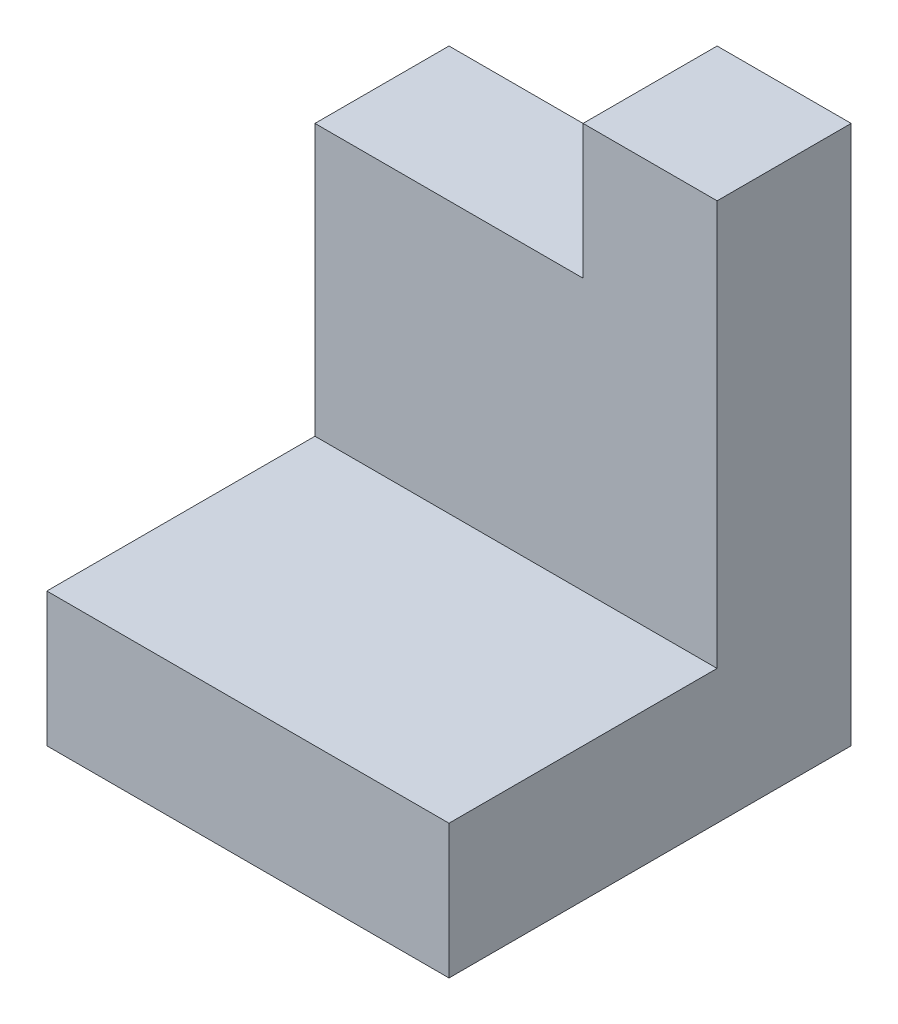
ISO-10303-21;
HEADER;
FILE_DESCRIPTION(('STEP AP214'),'2;1');
FILE_NAME('part.step','',(''),(''),'','','');
FILE_SCHEMA(('AUTOMOTIVE_DESIGN { 1 0 10303 214 1 1 1 1 }'));
ENDSEC;
DATA;
#1=APPLICATION_CONTEXT('core data for automotive mechanical design processes');
#2=APPLICATION_PROTOCOL_DEFINITION('international standard','automotive_design',2000,#1);
#3=PRODUCT_CONTEXT('',#1,'mechanical');
#4=PRODUCT('Part','Part','',(#3));
#5=PRODUCT_RELATED_PRODUCT_CATEGORY('part','',(#4));
#6=PRODUCT_DEFINITION_FORMATION('','',#4);
#7=PRODUCT_DEFINITION_CONTEXT('part definition',#1,'design');
#8=PRODUCT_DEFINITION('design','',#6,#7);
#9=PRODUCT_DEFINITION_SHAPE('','',#8);
#10=(LENGTH_UNIT() NAMED_UNIT(*) SI_UNIT(.MILLI.,.METRE.));
#11=(NAMED_UNIT(*) PLANE_ANGLE_UNIT() SI_UNIT($,.RADIAN.));
#12=(NAMED_UNIT(*) SI_UNIT($,.STERADIAN.) SOLID_ANGLE_UNIT());
#13=UNCERTAINTY_MEASURE_WITH_UNIT(LENGTH_MEASURE(1.E-05),#10,'distance_accuracy_value','');
#14=(GEOMETRIC_REPRESENTATION_CONTEXT(3) GLOBAL_UNCERTAINTY_ASSIGNED_CONTEXT((#13)) GLOBAL_UNIT_ASSIGNED_CONTEXT((#10,
#11,#12)) REPRESENTATION_CONTEXT('',''));
#15=CARTESIAN_POINT('',(0.,0.,0.));
#16=DIRECTION('',(0.,0.,1.));
#17=DIRECTION('',(1.,0.,0.));
#18=AXIS2_PLACEMENT_3D('',#15,#16,#17);
#19=CARTESIAN_POINT('',(60.,60.4177850932917,-20.));
#20=DIRECTION('',(0.,-1.,0.));
#21=DIRECTION('',(0.,0.,-1.));
#22=AXIS2_PLACEMENT_3D('',#19,#20,#21);
#23=PLANE('',#22);
#24=DIRECTION('',(0.,0.,1.));
#25=VECTOR('',#24,1.);
#26=CARTESIAN_POINT('',(40.,60.4177850932917,-20.));
#27=LINE('',#26,#25);
#28=CARTESIAN_POINT('',(40.,60.4177850932917,-20.));
#29=VERTEX_POINT('',#28);
#30=CARTESIAN_POINT('',(40.,60.4177850932917,0.));
#31=VERTEX_POINT('',#30);
#32=EDGE_CURVE('E59',#29,#31,#27,.T.);
#33=ORIENTED_EDGE('',*,*,#32,.F.);
#34=DIRECTION('',(1.,0.,0.));
#35=VECTOR('',#34,1.);
#36=CARTESIAN_POINT('',(60.,60.4177850932917,-20.));
#37=LINE('',#36,#35);
#38=CARTESIAN_POINT('',(0.,60.4177850932917,-20.));
#39=VERTEX_POINT('',#38);
#40=EDGE_CURVE('E144',#39,#29,#37,.T.);
#41=ORIENTED_EDGE('',*,*,#40,.F.);
#42=DIRECTION('',(0.,0.,1.));
#43=VECTOR('',#42,1.);
#44=CARTESIAN_POINT('',(0.,60.4177850932917,-20.));
#45=LINE('',#44,#43);
#46=CARTESIAN_POINT('',(0.,60.4177850932917,0.));
#47=VERTEX_POINT('',#46);
#48=EDGE_CURVE('E130',#39,#47,#45,.T.);
#49=ORIENTED_EDGE('',*,*,#48,.T.);
#50=DIRECTION('',(1.,0.,0.));
#51=VECTOR('',#50,1.);
#52=CARTESIAN_POINT('',(60.,60.4177850932917,0.));
#53=LINE('',#52,#51);
#54=EDGE_CURVE('E145',#47,#31,#53,.T.);
#55=ORIENTED_EDGE('',*,*,#54,.T.);
#56=EDGE_LOOP('',(#33,#41,#49,#55));
#57=FACE_BOUND('',#56,.T.);
#58=ADVANCED_FACE('F43',(#57),#23,.F.);
#59=CARTESIAN_POINT('',(0.,0.,40.));
#60=DIRECTION('',(1.,0.,0.));
#61=DIRECTION('',(0.,0.,-1.));
#62=AXIS2_PLACEMENT_3D('',#59,#60,#61);
#63=PLANE('',#62);
#64=DIRECTION('',(0.,0.,-1.));
#65=VECTOR('',#64,1.);
#66=CARTESIAN_POINT('',(0.,20.,40.));
#67=LINE('',#66,#65);
#68=CARTESIAN_POINT('',(0.,20.,40.));
#69=VERTEX_POINT('',#68);
#70=CARTESIAN_POINT('',(0.,20.,0.));
#71=VERTEX_POINT('',#70);
#72=EDGE_CURVE('E124',#69,#71,#67,.T.);
#73=ORIENTED_EDGE('',*,*,#72,.T.);
#74=DIRECTION('',(0.,1.,0.));
#75=VECTOR('',#74,1.);
#76=CARTESIAN_POINT('',(0.,0.,0.));
#77=LINE('',#76,#75);
#78=EDGE_CURVE('E81',#71,#47,#77,.T.);
#79=ORIENTED_EDGE('',*,*,#78,.T.);
#80=ORIENTED_EDGE('',*,*,#48,.F.);
#81=DIRECTION('',(0.,1.,0.));
#82=VECTOR('',#81,1.);
#83=CARTESIAN_POINT('',(0.,0.,-20.));
#84=LINE('',#83,#82);
#85=CARTESIAN_POINT('',(0.,0.,-20.));
#86=VERTEX_POINT('',#85);
#87=EDGE_CURVE('E157',#86,#39,#84,.T.);
#88=ORIENTED_EDGE('',*,*,#87,.F.);
#89=DIRECTION('',(0.,0.,-1.));
#90=VECTOR('',#89,1.);
#91=CARTESIAN_POINT('',(0.,0.,40.));
#92=LINE('',#91,#90);
#93=CARTESIAN_POINT('',(0.,0.,40.));
#94=VERTEX_POINT('',#93);
#95=EDGE_CURVE('E11',#94,#86,#92,.T.);
#96=ORIENTED_EDGE('',*,*,#95,.F.);
#97=DIRECTION('',(0.,-1.,0.));
#98=VECTOR('',#97,1.);
#99=CARTESIAN_POINT('',(0.,0.,40.));
#100=LINE('',#99,#98);
#101=EDGE_CURVE('E103',#69,#94,#100,.T.);
#102=ORIENTED_EDGE('',*,*,#101,.F.);
#103=EDGE_LOOP('',(#73,#79,#80,#88,#96,#102));
#104=FACE_BOUND('',#103,.T.);
#105=ADVANCED_FACE('F45',(#104),#63,.F.);
#106=CARTESIAN_POINT('',(0.,0.,40.));
#107=DIRECTION('',(0.,1.,0.));
#108=DIRECTION('',(0.,0.,1.));
#109=AXIS2_PLACEMENT_3D('',#106,#107,#108);
#110=PLANE('',#109);
#111=ORIENTED_EDGE('',*,*,#95,.T.);
#112=DIRECTION('',(-1.,0.,0.));
#113=VECTOR('',#112,1.);
#114=CARTESIAN_POINT('',(60.,0.,-20.));
#115=LINE('',#114,#113);
#116=CARTESIAN_POINT('',(60.,0.,-20.));
#117=VERTEX_POINT('',#116);
#118=EDGE_CURVE('E113',#117,#86,#115,.T.);
#119=ORIENTED_EDGE('',*,*,#118,.F.);
#120=DIRECTION('',(0.,0.,-1.));
#121=VECTOR('',#120,1.);
#122=CARTESIAN_POINT('',(60.,0.,40.));
#123=LINE('',#122,#121);
#124=CARTESIAN_POINT('',(60.,0.,40.));
#125=VERTEX_POINT('',#124);
#126=EDGE_CURVE('E52',#125,#117,#123,.T.);
#127=ORIENTED_EDGE('',*,*,#126,.F.);
#128=DIRECTION('',(1.,0.,0.));
#129=VECTOR('',#128,1.);
#130=CARTESIAN_POINT('',(0.,0.,40.));
#131=LINE('',#130,#129);
#132=EDGE_CURVE('E96',#94,#125,#131,.T.);
#133=ORIENTED_EDGE('',*,*,#132,.F.);
#134=EDGE_LOOP('',(#111,#119,#127,#133));
#135=FACE_BOUND('',#134,.T.);
#136=ADVANCED_FACE('F110',(#135),#110,.F.);
#137=CARTESIAN_POINT('',(60.,0.,40.));
#138=DIRECTION('',(-1.,0.,0.));
#139=DIRECTION('',(0.,0.,1.));
#140=AXIS2_PLACEMENT_3D('',#137,#138,#139);
#141=PLANE('',#140);
#142=ORIENTED_EDGE('',*,*,#126,.T.);
#143=DIRECTION('',(0.,-1.,0.));
#144=VECTOR('',#143,1.);
#145=CARTESIAN_POINT('',(60.,0.,-20.));
#146=LINE('',#145,#144);
#147=CARTESIAN_POINT('',(60.,80.4177850932917,-20.));
#148=VERTEX_POINT('',#147);
#149=EDGE_CURVE('E148',#148,#117,#146,.T.);
#150=ORIENTED_EDGE('',*,*,#149,.F.);
#151=DIRECTION('',(0.,0.,-1.));
#152=VECTOR('',#151,1.);
#153=CARTESIAN_POINT('',(60.,80.4177850932917,-20.));
#154=LINE('',#153,#152);
#155=CARTESIAN_POINT('',(60.,80.4177850932917,0.));
#156=VERTEX_POINT('',#155);
#157=EDGE_CURVE('E174',#156,#148,#154,.T.);
#158=ORIENTED_EDGE('',*,*,#157,.F.);
#159=DIRECTION('',(0.,-1.,0.));
#160=VECTOR('',#159,1.);
#161=CARTESIAN_POINT('',(60.,0.,0.));
#162=LINE('',#161,#160);
#163=CARTESIAN_POINT('',(60.,20.,0.));
#164=VERTEX_POINT('',#163);
#165=EDGE_CURVE('E151',#156,#164,#162,.T.);
#166=ORIENTED_EDGE('',*,*,#165,.T.);
#167=DIRECTION('',(0.,0.,-1.));
#168=VECTOR('',#167,1.);
#169=CARTESIAN_POINT('',(60.,20.,40.));
#170=LINE('',#169,#168);
#171=CARTESIAN_POINT('',(60.,20.,40.));
#172=VERTEX_POINT('',#171);
#173=EDGE_CURVE('E118',#172,#164,#170,.T.);
#174=ORIENTED_EDGE('',*,*,#173,.F.);
#175=DIRECTION('',(0.,1.,0.));
#176=VECTOR('',#175,1.);
#177=CARTESIAN_POINT('',(60.,0.,40.));
#178=LINE('',#177,#176);
#179=EDGE_CURVE('E100',#125,#172,#178,.T.);
#180=ORIENTED_EDGE('',*,*,#179,.F.);
#181=EDGE_LOOP('',(#142,#150,#158,#166,#174,#180));
#182=FACE_BOUND('',#181,.T.);
#183=ADVANCED_FACE('F119',(#182),#141,.F.);
#184=CARTESIAN_POINT('',(0.,20.,40.));
#185=DIRECTION('',(0.,-1.,0.));
#186=DIRECTION('',(0.,0.,-1.));
#187=AXIS2_PLACEMENT_3D('',#184,#185,#186);
#188=PLANE('',#187);
#189=DIRECTION('',(-1.,0.,0.));
#190=VECTOR('',#189,1.);
#191=CARTESIAN_POINT('',(0.,20.,0.));
#192=LINE('',#191,#190);
#193=EDGE_CURVE('E88',#164,#71,#192,.T.);
#194=ORIENTED_EDGE('',*,*,#193,.T.);
#195=ORIENTED_EDGE('',*,*,#72,.F.);
#196=DIRECTION('',(-1.,0.,0.));
#197=VECTOR('',#196,1.);
#198=CARTESIAN_POINT('',(0.,20.,40.));
#199=LINE('',#198,#197);
#200=EDGE_CURVE('E68',#172,#69,#199,.T.);
#201=ORIENTED_EDGE('',*,*,#200,.F.);
#202=ORIENTED_EDGE('',*,*,#173,.T.);
#203=EDGE_LOOP('',(#194,#195,#201,#202));
#204=FACE_BOUND('',#203,.T.);
#205=ADVANCED_FACE('F136',(#204),#188,.F.);
#206=CARTESIAN_POINT('',(0.,0.,40.));
#207=DIRECTION('',(0.,0.,-1.));
#208=DIRECTION('',(-1.,0.,0.));
#209=AXIS2_PLACEMENT_3D('',#206,#207,#208);
#210=PLANE('',#209);
#211=ORIENTED_EDGE('',*,*,#101,.T.);
#212=ORIENTED_EDGE('',*,*,#132,.T.);
#213=ORIENTED_EDGE('',*,*,#179,.T.);
#214=ORIENTED_EDGE('',*,*,#200,.T.);
#215=EDGE_LOOP('',(#211,#212,#213,#214));
#216=FACE_BOUND('',#215,.T.);
#217=ADVANCED_FACE('F98',(#216),#210,.F.);
#218=CARTESIAN_POINT('',(0.,0.,0.));
#219=DIRECTION('',(0.,0.,1.));
#220=DIRECTION('',(1.,0.,0.));
#221=AXIS2_PLACEMENT_3D('',#218,#219,#220);
#222=PLANE('',#221);
#223=ORIENTED_EDGE('',*,*,#193,.F.);
#224=ORIENTED_EDGE('',*,*,#165,.F.);
#225=DIRECTION('',(1.,0.,0.));
#226=VECTOR('',#225,1.);
#227=CARTESIAN_POINT('',(60.,80.4177850932917,0.));
#228=LINE('',#227,#226);
#229=CARTESIAN_POINT('',(40.,80.4177850932917,0.));
#230=VERTEX_POINT('',#229);
#231=EDGE_CURVE('E171',#230,#156,#228,.T.);
#232=ORIENTED_EDGE('',*,*,#231,.F.);
#233=DIRECTION('',(0.,-1.,0.));
#234=VECTOR('',#233,1.);
#235=CARTESIAN_POINT('',(40.,80.4177850932917,0.));
#236=LINE('',#235,#234);
#237=EDGE_CURVE('E167',#230,#31,#236,.T.);
#238=ORIENTED_EDGE('',*,*,#237,.T.);
#239=ORIENTED_EDGE('',*,*,#54,.F.);
#240=ORIENTED_EDGE('',*,*,#78,.F.);
#241=EDGE_LOOP('',(#223,#224,#232,#238,#239,#240));
#242=FACE_BOUND('',#241,.T.);
#243=ADVANCED_FACE('F213',(#242),#222,.T.);
#244=CARTESIAN_POINT('',(0.,0.,-20.));
#245=DIRECTION('',(0.,0.,1.));
#246=DIRECTION('',(1.,0.,0.));
#247=AXIS2_PLACEMENT_3D('',#244,#245,#246);
#248=PLANE('',#247);
#249=ORIENTED_EDGE('',*,*,#149,.T.);
#250=ORIENTED_EDGE('',*,*,#118,.T.);
#251=ORIENTED_EDGE('',*,*,#87,.T.);
#252=ORIENTED_EDGE('',*,*,#40,.T.);
#253=DIRECTION('',(0.,-1.,0.));
#254=VECTOR('',#253,1.);
#255=CARTESIAN_POINT('',(40.,80.4177850932917,-20.));
#256=LINE('',#255,#254);
#257=CARTESIAN_POINT('',(40.,80.4177850932917,-20.));
#258=VERTEX_POINT('',#257);
#259=EDGE_CURVE('E154',#258,#29,#256,.T.);
#260=ORIENTED_EDGE('',*,*,#259,.F.);
#261=DIRECTION('',(-1.,0.,0.));
#262=VECTOR('',#261,1.);
#263=CARTESIAN_POINT('',(60.,80.4177850932917,-20.));
#264=LINE('',#263,#262);
#265=EDGE_CURVE('E182',#148,#258,#264,.T.);
#266=ORIENTED_EDGE('',*,*,#265,.F.);
#267=EDGE_LOOP('',(#249,#250,#251,#252,#260,#266));
#268=FACE_BOUND('',#267,.T.);
#269=ADVANCED_FACE('F207',(#268),#248,.F.);
#270=CARTESIAN_POINT('',(40.,80.4177850932917,-20.));
#271=DIRECTION('',(1.,0.,0.));
#272=DIRECTION('',(0.,0.,-1.));
#273=AXIS2_PLACEMENT_3D('',#270,#271,#272);
#274=PLANE('',#273);
#275=ORIENTED_EDGE('',*,*,#32,.T.);
#276=ORIENTED_EDGE('',*,*,#237,.F.);
#277=DIRECTION('',(0.,0.,1.));
#278=VECTOR('',#277,1.);
#279=CARTESIAN_POINT('',(40.,80.4177850932917,-20.));
#280=LINE('',#279,#278);
#281=EDGE_CURVE('E178',#258,#230,#280,.T.);
#282=ORIENTED_EDGE('',*,*,#281,.F.);
#283=ORIENTED_EDGE('',*,*,#259,.T.);
#284=EDGE_LOOP('',(#275,#276,#282,#283));
#285=FACE_BOUND('',#284,.T.);
#286=ADVANCED_FACE('F211',(#285),#274,.F.);
#287=CARTESIAN_POINT('',(0.,80.4177850932917,0.));
#288=DIRECTION('',(0.,-1.,0.));
#289=DIRECTION('',(0.,0.,-1.));
#290=AXIS2_PLACEMENT_3D('',#287,#288,#289);
#291=PLANE('',#290);
#292=ORIENTED_EDGE('',*,*,#157,.T.);
#293=ORIENTED_EDGE('',*,*,#265,.T.);
#294=ORIENTED_EDGE('',*,*,#281,.T.);
#295=ORIENTED_EDGE('',*,*,#231,.T.);
#296=EDGE_LOOP('',(#292,#293,#294,#295));
#297=FACE_BOUND('',#296,.T.);
#298=ADVANCED_FACE('F191',(#297),#291,.F.);
#299=CLOSED_SHELL('',(#58,#105,#136,#183,#205,#217,#243,#269,#286,#298));
#300=MANIFOLD_SOLID_BREP('B2',#299);
#301=ADVANCED_BREP_SHAPE_REPRESENTATION('',(#18,#300),#14);
#302=SHAPE_DEFINITION_REPRESENTATION(#9,#301);
ENDSEC;
END-ISO-10303-21;
